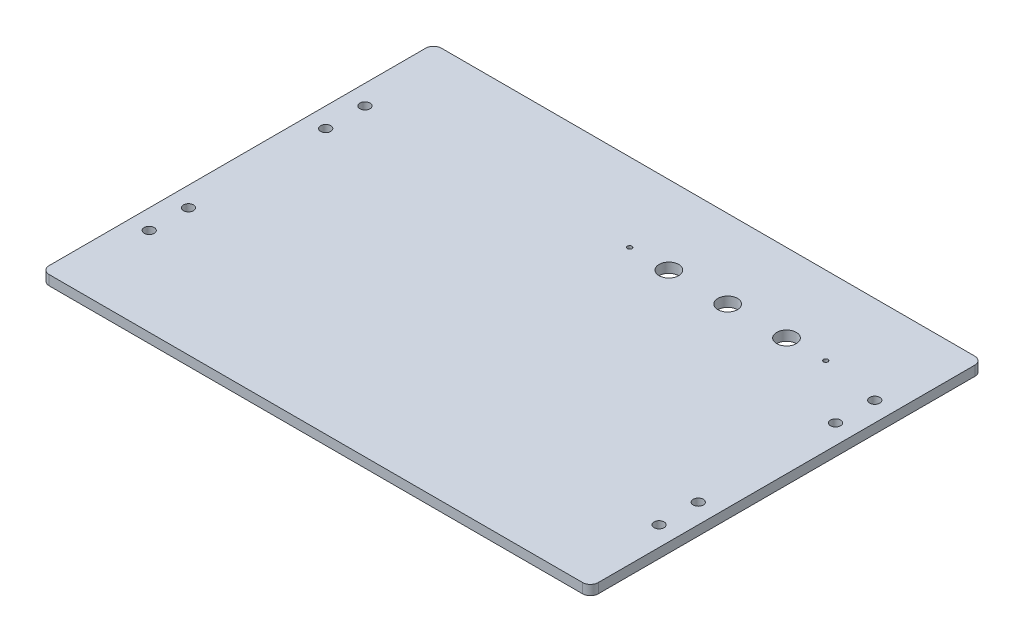
ISO-10303-21;
HEADER;
FILE_DESCRIPTION(('STEP AP214'),'2;1');
FILE_NAME('part.step','',(''),(''),'','','');
FILE_SCHEMA(('AUTOMOTIVE_DESIGN { 1 0 10303 214 1 1 1 1 }'));
ENDSEC;
DATA;
#1=APPLICATION_CONTEXT('core data for automotive mechanical design processes');
#2=APPLICATION_PROTOCOL_DEFINITION('international standard','automotive_design',2000,#1);
#3=PRODUCT_CONTEXT('',#1,'mechanical');
#4=PRODUCT('Part','Part','',(#3));
#5=PRODUCT_RELATED_PRODUCT_CATEGORY('part','',(#4));
#6=PRODUCT_DEFINITION_FORMATION('','',#4);
#7=PRODUCT_DEFINITION_CONTEXT('part definition',#1,'design');
#8=PRODUCT_DEFINITION('design','',#6,#7);
#9=PRODUCT_DEFINITION_SHAPE('','',#8);
#10=(LENGTH_UNIT() NAMED_UNIT(*) SI_UNIT(.MILLI.,.METRE.));
#11=(NAMED_UNIT(*) PLANE_ANGLE_UNIT() SI_UNIT($,.RADIAN.));
#12=(NAMED_UNIT(*) SI_UNIT($,.STERADIAN.) SOLID_ANGLE_UNIT());
#13=UNCERTAINTY_MEASURE_WITH_UNIT(LENGTH_MEASURE(1.E-05),#10,'distance_accuracy_value','');
#14=(GEOMETRIC_REPRESENTATION_CONTEXT(3) GLOBAL_UNCERTAINTY_ASSIGNED_CONTEXT((#13)) GLOBAL_UNIT_ASSIGNED_CONTEXT((#10,
#11,#12)) REPRESENTATION_CONTEXT('',''));
#15=CARTESIAN_POINT('',(0.,0.,0.));
#16=DIRECTION('',(0.,0.,1.));
#17=DIRECTION('',(1.,0.,0.));
#18=AXIS2_PLACEMENT_3D('',#15,#16,#17);
#19=CARTESIAN_POINT('',(177.8,6.35,0.));
#20=DIRECTION('',(1.,0.,0.));
#21=DIRECTION('',(0.,0.,-1.));
#22=AXIS2_PLACEMENT_3D('',#19,#20,#21);
#23=PLANE('',#22);
#24=DIRECTION('',(0.,0.,1.));
#25=VECTOR('',#24,1.);
#26=CARTESIAN_POINT('',(177.8,0.,0.));
#27=LINE('',#26,#25);
#28=CARTESIAN_POINT('',(177.8,0.,-121.92));
#29=VERTEX_POINT('',#28);
#30=CARTESIAN_POINT('',(177.8,0.,121.92));
#31=VERTEX_POINT('',#30);
#32=EDGE_CURVE('E129',#29,#31,#27,.T.);
#33=ORIENTED_EDGE('',*,*,#32,.F.);
#34=DIRECTION('',(0.,-1.,0.));
#35=VECTOR('',#34,1.);
#36=CARTESIAN_POINT('',(177.8,6.35,-121.92));
#37=LINE('',#36,#35);
#38=CARTESIAN_POINT('',(177.8,6.35,-121.92));
#39=VERTEX_POINT('',#38);
#40=EDGE_CURVE('E152',#29,#39,#37,.F.);
#41=ORIENTED_EDGE('',*,*,#40,.T.);
#42=DIRECTION('',(0.,0.,1.));
#43=VECTOR('',#42,1.);
#44=CARTESIAN_POINT('',(177.8,6.35,0.));
#45=LINE('',#44,#43);
#46=CARTESIAN_POINT('',(177.8,6.35,121.92));
#47=VERTEX_POINT('',#46);
#48=EDGE_CURVE('E127',#39,#47,#45,.T.);
#49=ORIENTED_EDGE('',*,*,#48,.T.);
#50=DIRECTION('',(0.,-1.,0.));
#51=VECTOR('',#50,1.);
#52=CARTESIAN_POINT('',(177.8,0.,121.92));
#53=LINE('',#52,#51);
#54=EDGE_CURVE('E149',#47,#31,#53,.T.);
#55=ORIENTED_EDGE('',*,*,#54,.T.);
#56=EDGE_LOOP('',(#33,#41,#49,#55));
#57=FACE_BOUND('',#56,.T.);
#58=ADVANCED_FACE('F34',(#57),#23,.T.);
#59=CARTESIAN_POINT('',(0.,6.35,-127.));
#60=DIRECTION('',(0.,0.,-1.));
#61=DIRECTION('',(-1.,0.,0.));
#62=AXIS2_PLACEMENT_3D('',#59,#60,#61);
#63=PLANE('',#62);
#64=DIRECTION('',(1.,0.,0.));
#65=VECTOR('',#64,1.);
#66=CARTESIAN_POINT('',(0.,0.,-127.));
#67=LINE('',#66,#65);
#68=CARTESIAN_POINT('',(-172.72,0.,-127.));
#69=VERTEX_POINT('',#68);
#70=CARTESIAN_POINT('',(172.72,0.,-127.));
#71=VERTEX_POINT('',#70);
#72=EDGE_CURVE('E125',#69,#71,#67,.T.);
#73=ORIENTED_EDGE('',*,*,#72,.F.);
#74=DIRECTION('',(0.,-1.,0.));
#75=VECTOR('',#74,1.);
#76=CARTESIAN_POINT('',(-172.72,6.35,-127.));
#77=LINE('',#76,#75);
#78=CARTESIAN_POINT('',(-172.72,6.35,-127.));
#79=VERTEX_POINT('',#78);
#80=EDGE_CURVE('E104',#69,#79,#77,.F.);
#81=ORIENTED_EDGE('',*,*,#80,.T.);
#82=DIRECTION('',(1.,0.,0.));
#83=VECTOR('',#82,1.);
#84=CARTESIAN_POINT('',(0.,6.35,-127.));
#85=LINE('',#84,#83);
#86=CARTESIAN_POINT('',(172.72,6.35,-127.));
#87=VERTEX_POINT('',#86);
#88=EDGE_CURVE('E168',#79,#87,#85,.T.);
#89=ORIENTED_EDGE('',*,*,#88,.T.);
#90=DIRECTION('',(0.,-1.,0.));
#91=VECTOR('',#90,1.);
#92=CARTESIAN_POINT('',(172.72,6.35,-127.));
#93=LINE('',#92,#91);
#94=EDGE_CURVE('E109',#87,#71,#93,.T.);
#95=ORIENTED_EDGE('',*,*,#94,.T.);
#96=EDGE_LOOP('',(#73,#81,#89,#95));
#97=FACE_BOUND('',#96,.T.);
#98=ADVANCED_FACE('F295',(#97),#63,.T.);
#99=CARTESIAN_POINT('',(-177.8,6.35,0.));
#100=DIRECTION('',(1.,0.,0.));
#101=DIRECTION('',(0.,0.,-1.));
#102=AXIS2_PLACEMENT_3D('',#99,#100,#101);
#103=PLANE('',#102);
#104=DIRECTION('',(0.,0.,1.));
#105=VECTOR('',#104,1.);
#106=CARTESIAN_POINT('',(-177.8,6.35,0.));
#107=LINE('',#106,#105);
#108=CARTESIAN_POINT('',(-177.8,6.35,-121.92));
#109=VERTEX_POINT('',#108);
#110=CARTESIAN_POINT('',(-177.8,6.35,121.92));
#111=VERTEX_POINT('',#110);
#112=EDGE_CURVE('E118',#109,#111,#107,.T.);
#113=ORIENTED_EDGE('',*,*,#112,.F.);
#114=DIRECTION('',(0.,-1.,0.));
#115=VECTOR('',#114,1.);
#116=CARTESIAN_POINT('',(-177.8,0.,-121.92));
#117=LINE('',#116,#115);
#118=CARTESIAN_POINT('',(-177.8,0.,-121.92));
#119=VERTEX_POINT('',#118);
#120=EDGE_CURVE('E103',#109,#119,#117,.T.);
#121=ORIENTED_EDGE('',*,*,#120,.T.);
#122=DIRECTION('',(0.,0.,1.));
#123=VECTOR('',#122,1.);
#124=CARTESIAN_POINT('',(-177.8,0.,0.));
#125=LINE('',#124,#123);
#126=CARTESIAN_POINT('',(-177.8,0.,121.92));
#127=VERTEX_POINT('',#126);
#128=EDGE_CURVE('E116',#119,#127,#125,.T.);
#129=ORIENTED_EDGE('',*,*,#128,.T.);
#130=DIRECTION('',(0.,-1.,0.));
#131=VECTOR('',#130,1.);
#132=CARTESIAN_POINT('',(-177.8,6.35,121.92));
#133=LINE('',#132,#131);
#134=EDGE_CURVE('E120',#127,#111,#133,.F.);
#135=ORIENTED_EDGE('',*,*,#134,.T.);
#136=EDGE_LOOP('',(#113,#121,#129,#135));
#137=FACE_BOUND('',#136,.T.);
#138=ADVANCED_FACE('F115',(#137),#103,.F.);
#139=CARTESIAN_POINT('',(0.,6.35,127.));
#140=DIRECTION('',(0.,0.,-1.));
#141=DIRECTION('',(-1.,0.,0.));
#142=AXIS2_PLACEMENT_3D('',#139,#140,#141);
#143=PLANE('',#142);
#144=DIRECTION('',(1.,0.,0.));
#145=VECTOR('',#144,1.);
#146=CARTESIAN_POINT('',(0.,0.,127.));
#147=LINE('',#146,#145);
#148=CARTESIAN_POINT('',(-172.72,0.,127.));
#149=VERTEX_POINT('',#148);
#150=CARTESIAN_POINT('',(172.72,0.,127.));
#151=VERTEX_POINT('',#150);
#152=EDGE_CURVE('E124',#149,#151,#147,.T.);
#153=ORIENTED_EDGE('',*,*,#152,.T.);
#154=DIRECTION('',(0.,-1.,0.));
#155=VECTOR('',#154,1.);
#156=CARTESIAN_POINT('',(172.72,6.35,127.));
#157=LINE('',#156,#155);
#158=CARTESIAN_POINT('',(172.72,6.35,127.));
#159=VERTEX_POINT('',#158);
#160=EDGE_CURVE('E11',#151,#159,#157,.F.);
#161=ORIENTED_EDGE('',*,*,#160,.T.);
#162=DIRECTION('',(1.,0.,0.));
#163=VECTOR('',#162,1.);
#164=CARTESIAN_POINT('',(0.,6.35,127.));
#165=LINE('',#164,#163);
#166=CARTESIAN_POINT('',(-172.72,6.35,127.));
#167=VERTEX_POINT('',#166);
#168=EDGE_CURVE('E133',#167,#159,#165,.T.);
#169=ORIENTED_EDGE('',*,*,#168,.F.);
#170=DIRECTION('',(0.,-1.,0.));
#171=VECTOR('',#170,1.);
#172=CARTESIAN_POINT('',(-172.72,6.35,127.));
#173=LINE('',#172,#171);
#174=EDGE_CURVE('E42',#167,#149,#173,.T.);
#175=ORIENTED_EDGE('',*,*,#174,.T.);
#176=EDGE_LOOP('',(#153,#161,#169,#175));
#177=FACE_BOUND('',#176,.T.);
#178=ADVANCED_FACE('F155',(#177),#143,.F.);
#179=CARTESIAN_POINT('',(0.,6.35,0.));
#180=DIRECTION('',(0.,1.,0.));
#181=DIRECTION('',(0.,0.,1.));
#182=AXIS2_PLACEMENT_3D('',#179,#180,#181);
#183=PLANE('',#182);
#184=CARTESIAN_POINT('',(0.,6.35,-76.2));
#185=DIRECTION('',(0.,1.,0.));
#186=DIRECTION('',(0.,0.,1.));
#187=AXIS2_PLACEMENT_3D('',#184,#185,#186);
#188=CIRCLE('',#187,1.4605);
#189=CARTESIAN_POINT('',(0.,6.35,-74.7395));
#190=VERTEX_POINT('',#189);
#191=EDGE_CURVE('E250',#190,#190,#188,.T.);
#192=ORIENTED_EDGE('',*,*,#191,.F.);
#193=EDGE_LOOP('',(#192));
#194=FACE_BOUND('',#193,.T.);
#195=CARTESIAN_POINT('',(127.,6.35,-76.2));
#196=DIRECTION('',(0.,1.,0.));
#197=DIRECTION('',(0.,0.,1.));
#198=AXIS2_PLACEMENT_3D('',#195,#196,#197);
#199=CIRCLE('',#198,1.4605);
#200=CARTESIAN_POINT('',(127.,6.35,-74.7395));
#201=VERTEX_POINT('',#200);
#202=EDGE_CURVE('E244',#201,#201,#199,.T.);
#203=ORIENTED_EDGE('',*,*,#202,.F.);
#204=EDGE_LOOP('',(#203));
#205=FACE_BOUND('',#204,.T.);
#206=CARTESIAN_POINT('',(63.5,6.35,-76.2));
#207=DIRECTION('',(0.,1.,0.));
#208=DIRECTION('',(0.,0.,1.));
#209=AXIS2_PLACEMENT_3D('',#206,#207,#208);
#210=CIRCLE('',#209,6.35000000000001);
#211=CARTESIAN_POINT('',(63.5,6.35,-69.85));
#212=VERTEX_POINT('',#211);
#213=EDGE_CURVE('E239',#212,#212,#210,.T.);
#214=ORIENTED_EDGE('',*,*,#213,.F.);
#215=EDGE_LOOP('',(#214));
#216=FACE_BOUND('',#215,.T.);
#217=CARTESIAN_POINT('',(101.6,6.35,-76.2));
#218=DIRECTION('',(0.,1.,0.));
#219=DIRECTION('',(0.,0.,1.));
#220=AXIS2_PLACEMENT_3D('',#217,#218,#219);
#221=CIRCLE('',#220,6.34999999999999);
#222=CARTESIAN_POINT('',(101.6,6.35,-69.85));
#223=VERTEX_POINT('',#222);
#224=EDGE_CURVE('E232',#223,#223,#221,.T.);
#225=ORIENTED_EDGE('',*,*,#224,.F.);
#226=EDGE_LOOP('',(#225));
#227=FACE_BOUND('',#226,.T.);
#228=CARTESIAN_POINT('',(25.4,6.35,-76.2));
#229=DIRECTION('',(0.,1.,0.));
#230=DIRECTION('',(0.,0.,1.));
#231=AXIS2_PLACEMENT_3D('',#228,#229,#230);
#232=CIRCLE('',#231,6.35);
#233=CARTESIAN_POINT('',(25.4,6.35,-69.85));
#234=VERTEX_POINT('',#233);
#235=EDGE_CURVE('E226',#234,#234,#232,.T.);
#236=ORIENTED_EDGE('',*,*,#235,.F.);
#237=EDGE_LOOP('',(#236));
#238=FACE_BOUND('',#237,.T.);
#239=CARTESIAN_POINT('',(-165.1,6.35,-44.45));
#240=DIRECTION('',(0.,1.,0.));
#241=DIRECTION('',(0.,0.,1.));
#242=AXIS2_PLACEMENT_3D('',#239,#240,#241);
#243=CIRCLE('',#242,3.26389999999998);
#244=CARTESIAN_POINT('',(-165.1,6.35,-41.1861));
#245=VERTEX_POINT('',#244);
#246=EDGE_CURVE('E221',#245,#245,#243,.T.);
#247=ORIENTED_EDGE('',*,*,#246,.F.);
#248=EDGE_LOOP('',(#247));
#249=FACE_BOUND('',#248,.T.);
#250=CARTESIAN_POINT('',(-165.1,6.35,44.45));
#251=DIRECTION('',(0.,1.,0.));
#252=DIRECTION('',(0.,0.,1.));
#253=AXIS2_PLACEMENT_3D('',#250,#251,#252);
#254=CIRCLE('',#253,3.26389999999998);
#255=CARTESIAN_POINT('',(-165.1,6.35,47.7139));
#256=VERTEX_POINT('',#255);
#257=EDGE_CURVE('E215',#256,#256,#254,.T.);
#258=ORIENTED_EDGE('',*,*,#257,.F.);
#259=EDGE_LOOP('',(#258));
#260=FACE_BOUND('',#259,.T.);
#261=CARTESIAN_POINT('',(-165.1,6.35,69.85));
#262=DIRECTION('',(0.,1.,0.));
#263=DIRECTION('',(0.,0.,1.));
#264=AXIS2_PLACEMENT_3D('',#261,#262,#263);
#265=CIRCLE('',#264,3.26390000000001);
#266=CARTESIAN_POINT('',(-165.1,6.35,73.1139));
#267=VERTEX_POINT('',#266);
#268=EDGE_CURVE('E209',#267,#267,#265,.T.);
#269=ORIENTED_EDGE('',*,*,#268,.F.);
#270=EDGE_LOOP('',(#269));
#271=FACE_BOUND('',#270,.T.);
#272=CARTESIAN_POINT('',(165.1,6.35,69.85));
#273=DIRECTION('',(0.,1.,0.));
#274=DIRECTION('',(0.,0.,-1.));
#275=AXIS2_PLACEMENT_3D('',#272,#273,#274);
#276=CIRCLE('',#275,3.26390000000001);
#277=CARTESIAN_POINT('',(165.1,6.35,66.5861));
#278=VERTEX_POINT('',#277);
#279=EDGE_CURVE('E203',#278,#278,#276,.T.);
#280=ORIENTED_EDGE('',*,*,#279,.F.);
#281=EDGE_LOOP('',(#280));
#282=FACE_BOUND('',#281,.T.);
#283=CARTESIAN_POINT('',(165.1,6.35,44.45));
#284=DIRECTION('',(0.,1.,0.));
#285=DIRECTION('',(0.,0.,-1.));
#286=AXIS2_PLACEMENT_3D('',#283,#284,#285);
#287=CIRCLE('',#286,3.26389999999998);
#288=CARTESIAN_POINT('',(165.1,6.35,41.1861));
#289=VERTEX_POINT('',#288);
#290=EDGE_CURVE('E197',#289,#289,#287,.T.);
#291=ORIENTED_EDGE('',*,*,#290,.F.);
#292=EDGE_LOOP('',(#291));
#293=FACE_BOUND('',#292,.T.);
#294=CARTESIAN_POINT('',(165.1,6.35,-44.45));
#295=DIRECTION('',(0.,1.,0.));
#296=DIRECTION('',(0.,0.,-1.));
#297=AXIS2_PLACEMENT_3D('',#294,#295,#296);
#298=CIRCLE('',#297,3.26389999999998);
#299=CARTESIAN_POINT('',(165.1,6.35,-47.7139));
#300=VERTEX_POINT('',#299);
#301=EDGE_CURVE('E191',#300,#300,#298,.T.);
#302=ORIENTED_EDGE('',*,*,#301,.F.);
#303=EDGE_LOOP('',(#302));
#304=FACE_BOUND('',#303,.T.);
#305=CARTESIAN_POINT('',(165.1,6.35,-69.85));
#306=DIRECTION('',(0.,1.,0.));
#307=DIRECTION('',(0.,0.,-1.));
#308=AXIS2_PLACEMENT_3D('',#305,#306,#307);
#309=CIRCLE('',#308,3.26389999999998);
#310=CARTESIAN_POINT('',(165.1,6.35,-73.1139));
#311=VERTEX_POINT('',#310);
#312=EDGE_CURVE('E184',#311,#311,#309,.T.);
#313=ORIENTED_EDGE('',*,*,#312,.F.);
#314=EDGE_LOOP('',(#313));
#315=FACE_BOUND('',#314,.T.);
#316=CARTESIAN_POINT('',(-165.1,6.35,-69.85));
#317=DIRECTION('',(0.,1.,0.));
#318=DIRECTION('',(0.,0.,1.));
#319=AXIS2_PLACEMENT_3D('',#316,#317,#318);
#320=CIRCLE('',#319,3.26389999999998);
#321=CARTESIAN_POINT('',(-165.1,6.35,-66.5861));
#322=VERTEX_POINT('',#321);
#323=EDGE_CURVE('E173',#322,#322,#320,.T.);
#324=ORIENTED_EDGE('',*,*,#323,.F.);
#325=EDGE_LOOP('',(#324));
#326=FACE_BOUND('',#325,.T.);
#327=ORIENTED_EDGE('',*,*,#88,.F.);
#328=CARTESIAN_POINT('',(-172.72,6.35,-121.92));
#329=DIRECTION('',(0.,1.,0.));
#330=DIRECTION('',(0.,0.,1.));
#331=AXIS2_PLACEMENT_3D('',#328,#329,#330);
#332=CIRCLE('',#331,5.08);
#333=EDGE_CURVE('E147',#79,#109,#332,.T.);
#334=ORIENTED_EDGE('',*,*,#333,.T.);
#335=ORIENTED_EDGE('',*,*,#112,.T.);
#336=CARTESIAN_POINT('',(-172.72,6.35,121.92));
#337=DIRECTION('',(0.,1.,0.));
#338=DIRECTION('',(0.,0.,1.));
#339=AXIS2_PLACEMENT_3D('',#336,#337,#338);
#340=CIRCLE('',#339,5.08);
#341=EDGE_CURVE('E54',#111,#167,#340,.T.);
#342=ORIENTED_EDGE('',*,*,#341,.T.);
#343=ORIENTED_EDGE('',*,*,#168,.T.);
#344=CARTESIAN_POINT('',(172.72,6.35,121.92));
#345=DIRECTION('',(0.,1.,0.));
#346=DIRECTION('',(0.,0.,1.));
#347=AXIS2_PLACEMENT_3D('',#344,#345,#346);
#348=CIRCLE('',#347,5.08);
#349=EDGE_CURVE('E143',#159,#47,#348,.T.);
#350=ORIENTED_EDGE('',*,*,#349,.T.);
#351=ORIENTED_EDGE('',*,*,#48,.F.);
#352=CARTESIAN_POINT('',(172.72,6.35,-121.92));
#353=DIRECTION('',(0.,1.,0.));
#354=DIRECTION('',(0.,0.,1.));
#355=AXIS2_PLACEMENT_3D('',#352,#353,#354);
#356=CIRCLE('',#355,5.08);
#357=EDGE_CURVE('E145',#39,#87,#356,.T.);
#358=ORIENTED_EDGE('',*,*,#357,.T.);
#359=EDGE_LOOP('',(#327,#334,#335,#342,#343,#350,#351,#358));
#360=FACE_BOUND('',#359,.T.);
#361=ADVANCED_FACE('F265',(#194,#205,#216,#227,#238,#249,#260,#271,#282,#293,#304,#315,#326,
#360),#183,.T.);
#362=CARTESIAN_POINT('',(0.,0.,0.));
#363=DIRECTION('',(0.,1.,0.));
#364=DIRECTION('',(0.,0.,1.));
#365=AXIS2_PLACEMENT_3D('',#362,#363,#364);
#366=PLANE('',#365);
#367=CARTESIAN_POINT('',(0.,0.,-76.2));
#368=DIRECTION('',(0.,1.,0.));
#369=DIRECTION('',(0.,0.,1.));
#370=AXIS2_PLACEMENT_3D('',#367,#368,#369);
#371=CIRCLE('',#370,1.4605);
#372=CARTESIAN_POINT('',(0.,0.,-74.7395));
#373=VERTEX_POINT('',#372);
#374=EDGE_CURVE('E247',#373,#373,#371,.T.);
#375=ORIENTED_EDGE('',*,*,#374,.T.);
#376=EDGE_LOOP('',(#375));
#377=FACE_BOUND('',#376,.T.);
#378=CARTESIAN_POINT('',(127.,0.,-76.2));
#379=DIRECTION('',(0.,1.,0.));
#380=DIRECTION('',(0.,0.,1.));
#381=AXIS2_PLACEMENT_3D('',#378,#379,#380);
#382=CIRCLE('',#381,1.4605);
#383=CARTESIAN_POINT('',(127.,0.,-74.7395));
#384=VERTEX_POINT('',#383);
#385=EDGE_CURVE('E236',#384,#384,#382,.T.);
#386=ORIENTED_EDGE('',*,*,#385,.T.);
#387=EDGE_LOOP('',(#386));
#388=FACE_BOUND('',#387,.T.);
#389=CARTESIAN_POINT('',(63.5,0.,-76.2));
#390=DIRECTION('',(0.,1.,0.));
#391=DIRECTION('',(0.,0.,1.));
#392=AXIS2_PLACEMENT_3D('',#389,#390,#391);
#393=CIRCLE('',#392,6.35000000000001);
#394=CARTESIAN_POINT('',(63.5,0.,-69.85));
#395=VERTEX_POINT('',#394);
#396=EDGE_CURVE('E229',#395,#395,#393,.T.);
#397=ORIENTED_EDGE('',*,*,#396,.T.);
#398=EDGE_LOOP('',(#397));
#399=FACE_BOUND('',#398,.T.);
#400=CARTESIAN_POINT('',(101.6,0.,-76.2));
#401=DIRECTION('',(0.,1.,0.));
#402=DIRECTION('',(0.,0.,1.));
#403=AXIS2_PLACEMENT_3D('',#400,#401,#402);
#404=CIRCLE('',#403,6.34999999999999);
#405=CARTESIAN_POINT('',(101.6,0.,-69.85));
#406=VERTEX_POINT('',#405);
#407=EDGE_CURVE('E235',#406,#406,#404,.T.);
#408=ORIENTED_EDGE('',*,*,#407,.T.);
#409=EDGE_LOOP('',(#408));
#410=FACE_BOUND('',#409,.T.);
#411=CARTESIAN_POINT('',(25.4,0.,-76.2));
#412=DIRECTION('',(0.,1.,0.));
#413=DIRECTION('',(0.,0.,1.));
#414=AXIS2_PLACEMENT_3D('',#411,#412,#413);
#415=CIRCLE('',#414,6.35);
#416=CARTESIAN_POINT('',(25.4,0.,-69.85));
#417=VERTEX_POINT('',#416);
#418=EDGE_CURVE('E188',#417,#417,#415,.T.);
#419=ORIENTED_EDGE('',*,*,#418,.T.);
#420=EDGE_LOOP('',(#419));
#421=FACE_BOUND('',#420,.T.);
#422=CARTESIAN_POINT('',(-165.1,0.,-44.45));
#423=DIRECTION('',(0.,1.,0.));
#424=DIRECTION('',(0.,0.,1.));
#425=AXIS2_PLACEMENT_3D('',#422,#423,#424);
#426=CIRCLE('',#425,3.26389999999998);
#427=CARTESIAN_POINT('',(-165.1,0.,-41.1861));
#428=VERTEX_POINT('',#427);
#429=EDGE_CURVE('E182',#428,#428,#426,.T.);
#430=ORIENTED_EDGE('',*,*,#429,.T.);
#431=EDGE_LOOP('',(#430));
#432=FACE_BOUND('',#431,.T.);
#433=CARTESIAN_POINT('',(-165.1,0.,44.45));
#434=DIRECTION('',(0.,1.,0.));
#435=DIRECTION('',(0.,0.,1.));
#436=AXIS2_PLACEMENT_3D('',#433,#434,#435);
#437=CIRCLE('',#436,3.26389999999998);
#438=CARTESIAN_POINT('',(-165.1,0.,47.7139));
#439=VERTEX_POINT('',#438);
#440=EDGE_CURVE('E218',#439,#439,#437,.T.);
#441=ORIENTED_EDGE('',*,*,#440,.T.);
#442=EDGE_LOOP('',(#441));
#443=FACE_BOUND('',#442,.T.);
#444=CARTESIAN_POINT('',(-165.1,0.,69.85));
#445=DIRECTION('',(0.,1.,0.));
#446=DIRECTION('',(0.,0.,1.));
#447=AXIS2_PLACEMENT_3D('',#444,#445,#446);
#448=CIRCLE('',#447,3.26390000000001);
#449=CARTESIAN_POINT('',(-165.1,0.,73.1139));
#450=VERTEX_POINT('',#449);
#451=EDGE_CURVE('E212',#450,#450,#448,.T.);
#452=ORIENTED_EDGE('',*,*,#451,.T.);
#453=EDGE_LOOP('',(#452));
#454=FACE_BOUND('',#453,.T.);
#455=CARTESIAN_POINT('',(165.1,0.,69.85));
#456=DIRECTION('',(0.,1.,0.));
#457=DIRECTION('',(0.,0.,-1.));
#458=AXIS2_PLACEMENT_3D('',#455,#456,#457);
#459=CIRCLE('',#458,3.26390000000001);
#460=CARTESIAN_POINT('',(165.1,0.,66.5861));
#461=VERTEX_POINT('',#460);
#462=EDGE_CURVE('E206',#461,#461,#459,.T.);
#463=ORIENTED_EDGE('',*,*,#462,.T.);
#464=EDGE_LOOP('',(#463));
#465=FACE_BOUND('',#464,.T.);
#466=CARTESIAN_POINT('',(165.1,0.,44.45));
#467=DIRECTION('',(0.,1.,0.));
#468=DIRECTION('',(0.,0.,-1.));
#469=AXIS2_PLACEMENT_3D('',#466,#467,#468);
#470=CIRCLE('',#469,3.26389999999998);
#471=CARTESIAN_POINT('',(165.1,0.,41.1861));
#472=VERTEX_POINT('',#471);
#473=EDGE_CURVE('E200',#472,#472,#470,.T.);
#474=ORIENTED_EDGE('',*,*,#473,.T.);
#475=EDGE_LOOP('',(#474));
#476=FACE_BOUND('',#475,.T.);
#477=CARTESIAN_POINT('',(165.1,0.,-44.45));
#478=DIRECTION('',(0.,1.,0.));
#479=DIRECTION('',(0.,0.,-1.));
#480=AXIS2_PLACEMENT_3D('',#477,#478,#479);
#481=CIRCLE('',#480,3.26389999999998);
#482=CARTESIAN_POINT('',(165.1,0.,-47.7139));
#483=VERTEX_POINT('',#482);
#484=EDGE_CURVE('E194',#483,#483,#481,.T.);
#485=ORIENTED_EDGE('',*,*,#484,.T.);
#486=EDGE_LOOP('',(#485));
#487=FACE_BOUND('',#486,.T.);
#488=CARTESIAN_POINT('',(165.1,0.,-69.85));
#489=DIRECTION('',(0.,1.,0.));
#490=DIRECTION('',(0.,0.,-1.));
#491=AXIS2_PLACEMENT_3D('',#488,#489,#490);
#492=CIRCLE('',#491,3.26389999999998);
#493=CARTESIAN_POINT('',(165.1,0.,-73.1139));
#494=VERTEX_POINT('',#493);
#495=EDGE_CURVE('E187',#494,#494,#492,.T.);
#496=ORIENTED_EDGE('',*,*,#495,.T.);
#497=EDGE_LOOP('',(#496));
#498=FACE_BOUND('',#497,.T.);
#499=CARTESIAN_POINT('',(-165.1,0.,-69.85));
#500=DIRECTION('',(0.,1.,0.));
#501=DIRECTION('',(0.,0.,1.));
#502=AXIS2_PLACEMENT_3D('',#499,#500,#501);
#503=CIRCLE('',#502,3.26389999999998);
#504=CARTESIAN_POINT('',(-165.1,0.,-66.5861));
#505=VERTEX_POINT('',#504);
#506=EDGE_CURVE('E177',#505,#505,#503,.T.);
#507=ORIENTED_EDGE('',*,*,#506,.T.);
#508=EDGE_LOOP('',(#507));
#509=FACE_BOUND('',#508,.T.);
#510=ORIENTED_EDGE('',*,*,#128,.F.);
#511=CARTESIAN_POINT('',(-172.72,0.,-121.92));
#512=DIRECTION('',(0.,1.,0.));
#513=DIRECTION('',(0.,0.,1.));
#514=AXIS2_PLACEMENT_3D('',#511,#512,#513);
#515=CIRCLE('',#514,5.08);
#516=EDGE_CURVE('E99',#119,#69,#515,.F.);
#517=ORIENTED_EDGE('',*,*,#516,.T.);
#518=ORIENTED_EDGE('',*,*,#72,.T.);
#519=CARTESIAN_POINT('',(172.72,0.,-121.92));
#520=DIRECTION('',(0.,1.,0.));
#521=DIRECTION('',(0.,0.,1.));
#522=AXIS2_PLACEMENT_3D('',#519,#520,#521);
#523=CIRCLE('',#522,5.08);
#524=EDGE_CURVE('E110',#71,#29,#523,.F.);
#525=ORIENTED_EDGE('',*,*,#524,.T.);
#526=ORIENTED_EDGE('',*,*,#32,.T.);
#527=CARTESIAN_POINT('',(172.72,0.,121.92));
#528=DIRECTION('',(0.,1.,0.));
#529=DIRECTION('',(0.,0.,1.));
#530=AXIS2_PLACEMENT_3D('',#527,#528,#529);
#531=CIRCLE('',#530,5.08);
#532=EDGE_CURVE('E136',#31,#151,#531,.F.);
#533=ORIENTED_EDGE('',*,*,#532,.T.);
#534=ORIENTED_EDGE('',*,*,#152,.F.);
#535=CARTESIAN_POINT('',(-172.72,0.,121.92));
#536=DIRECTION('',(0.,1.,0.));
#537=DIRECTION('',(0.,0.,1.));
#538=AXIS2_PLACEMENT_3D('',#535,#536,#537);
#539=CIRCLE('',#538,5.08);
#540=EDGE_CURVE('E119',#149,#127,#539,.F.);
#541=ORIENTED_EDGE('',*,*,#540,.T.);
#542=EDGE_LOOP('',(#510,#517,#518,#525,#526,#533,#534,#541));
#543=FACE_BOUND('',#542,.T.);
#544=ADVANCED_FACE('F122',(#377,#388,#399,#410,#421,#432,#443,#454,#465,#476,#487,#498,#509,
#543),#366,.F.);
#545=CARTESIAN_POINT('',(-165.1,0.,-69.85));
#546=DIRECTION('',(0.,1.,0.));
#547=DIRECTION('',(0.,0.,1.));
#548=AXIS2_PLACEMENT_3D('',#545,#546,#547);
#549=CYLINDRICAL_SURFACE('',#548,3.26389999999998);
#550=ORIENTED_EDGE('',*,*,#506,.F.);
#551=EDGE_LOOP('',(#550));
#552=FACE_BOUND('',#551,.T.);
#553=ORIENTED_EDGE('',*,*,#323,.T.);
#554=EDGE_LOOP('',(#553));
#555=FACE_BOUND('',#554,.T.);
#556=ADVANCED_FACE('F317',(#552,#555),#549,.F.);
#557=CARTESIAN_POINT('',(165.1,0.,-69.85));
#558=DIRECTION('',(0.,1.,0.));
#559=DIRECTION('',(0.,0.,1.));
#560=AXIS2_PLACEMENT_3D('',#557,#558,#559);
#561=CYLINDRICAL_SURFACE('',#560,3.26389999999998);
#562=ORIENTED_EDGE('',*,*,#495,.F.);
#563=EDGE_LOOP('',(#562));
#564=FACE_BOUND('',#563,.T.);
#565=ORIENTED_EDGE('',*,*,#312,.T.);
#566=EDGE_LOOP('',(#565));
#567=FACE_BOUND('',#566,.T.);
#568=ADVANCED_FACE('F321',(#564,#567),#561,.F.);
#569=CARTESIAN_POINT('',(165.1,0.,-44.45));
#570=DIRECTION('',(0.,1.,0.));
#571=DIRECTION('',(0.,0.,1.));
#572=AXIS2_PLACEMENT_3D('',#569,#570,#571);
#573=CYLINDRICAL_SURFACE('',#572,3.26389999999998);
#574=ORIENTED_EDGE('',*,*,#484,.F.);
#575=EDGE_LOOP('',(#574));
#576=FACE_BOUND('',#575,.T.);
#577=ORIENTED_EDGE('',*,*,#301,.T.);
#578=EDGE_LOOP('',(#577));
#579=FACE_BOUND('',#578,.T.);
#580=ADVANCED_FACE('F325',(#576,#579),#573,.F.);
#581=CARTESIAN_POINT('',(165.1,0.,44.45));
#582=DIRECTION('',(0.,1.,0.));
#583=DIRECTION('',(0.,0.,1.));
#584=AXIS2_PLACEMENT_3D('',#581,#582,#583);
#585=CYLINDRICAL_SURFACE('',#584,3.26389999999998);
#586=ORIENTED_EDGE('',*,*,#473,.F.);
#587=EDGE_LOOP('',(#586));
#588=FACE_BOUND('',#587,.T.);
#589=ORIENTED_EDGE('',*,*,#290,.T.);
#590=EDGE_LOOP('',(#589));
#591=FACE_BOUND('',#590,.T.);
#592=ADVANCED_FACE('F329',(#588,#591),#585,.F.);
#593=CARTESIAN_POINT('',(165.1,0.,69.85));
#594=DIRECTION('',(0.,1.,0.));
#595=DIRECTION('',(0.,0.,1.));
#596=AXIS2_PLACEMENT_3D('',#593,#594,#595);
#597=CYLINDRICAL_SURFACE('',#596,3.26390000000001);
#598=ORIENTED_EDGE('',*,*,#462,.F.);
#599=EDGE_LOOP('',(#598));
#600=FACE_BOUND('',#599,.T.);
#601=ORIENTED_EDGE('',*,*,#279,.T.);
#602=EDGE_LOOP('',(#601));
#603=FACE_BOUND('',#602,.T.);
#604=ADVANCED_FACE('F333',(#600,#603),#597,.F.);
#605=CARTESIAN_POINT('',(-165.1,0.,69.85));
#606=DIRECTION('',(0.,1.,0.));
#607=DIRECTION('',(0.,0.,1.));
#608=AXIS2_PLACEMENT_3D('',#605,#606,#607);
#609=CYLINDRICAL_SURFACE('',#608,3.26390000000001);
#610=ORIENTED_EDGE('',*,*,#451,.F.);
#611=EDGE_LOOP('',(#610));
#612=FACE_BOUND('',#611,.T.);
#613=ORIENTED_EDGE('',*,*,#268,.T.);
#614=EDGE_LOOP('',(#613));
#615=FACE_BOUND('',#614,.T.);
#616=ADVANCED_FACE('F337',(#612,#615),#609,.F.);
#617=CARTESIAN_POINT('',(-165.1,0.,44.45));
#618=DIRECTION('',(0.,1.,0.));
#619=DIRECTION('',(0.,0.,1.));
#620=AXIS2_PLACEMENT_3D('',#617,#618,#619);
#621=CYLINDRICAL_SURFACE('',#620,3.26389999999998);
#622=ORIENTED_EDGE('',*,*,#440,.F.);
#623=EDGE_LOOP('',(#622));
#624=FACE_BOUND('',#623,.T.);
#625=ORIENTED_EDGE('',*,*,#257,.T.);
#626=EDGE_LOOP('',(#625));
#627=FACE_BOUND('',#626,.T.);
#628=ADVANCED_FACE('F341',(#624,#627),#621,.F.);
#629=CARTESIAN_POINT('',(-165.1,0.,-44.45));
#630=DIRECTION('',(0.,1.,0.));
#631=DIRECTION('',(0.,0.,1.));
#632=AXIS2_PLACEMENT_3D('',#629,#630,#631);
#633=CYLINDRICAL_SURFACE('',#632,3.26389999999998);
#634=ORIENTED_EDGE('',*,*,#429,.F.);
#635=EDGE_LOOP('',(#634));
#636=FACE_BOUND('',#635,.T.);
#637=ORIENTED_EDGE('',*,*,#246,.T.);
#638=EDGE_LOOP('',(#637));
#639=FACE_BOUND('',#638,.T.);
#640=ADVANCED_FACE('F345',(#636,#639),#633,.F.);
#641=CARTESIAN_POINT('',(25.4,0.,-76.2));
#642=DIRECTION('',(0.,1.,0.));
#643=DIRECTION('',(0.,0.,1.));
#644=AXIS2_PLACEMENT_3D('',#641,#642,#643);
#645=CYLINDRICAL_SURFACE('',#644,6.35);
#646=ORIENTED_EDGE('',*,*,#418,.F.);
#647=EDGE_LOOP('',(#646));
#648=FACE_BOUND('',#647,.T.);
#649=ORIENTED_EDGE('',*,*,#235,.T.);
#650=EDGE_LOOP('',(#649));
#651=FACE_BOUND('',#650,.T.);
#652=ADVANCED_FACE('F349',(#648,#651),#645,.F.);
#653=CARTESIAN_POINT('',(101.6,0.,-76.2));
#654=DIRECTION('',(0.,1.,0.));
#655=DIRECTION('',(0.,0.,1.));
#656=AXIS2_PLACEMENT_3D('',#653,#654,#655);
#657=CYLINDRICAL_SURFACE('',#656,6.34999999999999);
#658=ORIENTED_EDGE('',*,*,#407,.F.);
#659=EDGE_LOOP('',(#658));
#660=FACE_BOUND('',#659,.T.);
#661=ORIENTED_EDGE('',*,*,#224,.T.);
#662=EDGE_LOOP('',(#661));
#663=FACE_BOUND('',#662,.T.);
#664=ADVANCED_FACE('F353',(#660,#663),#657,.F.);
#665=CARTESIAN_POINT('',(63.5,0.,-76.2));
#666=DIRECTION('',(0.,1.,0.));
#667=DIRECTION('',(0.,0.,1.));
#668=AXIS2_PLACEMENT_3D('',#665,#666,#667);
#669=CYLINDRICAL_SURFACE('',#668,6.35000000000001);
#670=ORIENTED_EDGE('',*,*,#396,.F.);
#671=EDGE_LOOP('',(#670));
#672=FACE_BOUND('',#671,.T.);
#673=ORIENTED_EDGE('',*,*,#213,.T.);
#674=EDGE_LOOP('',(#673));
#675=FACE_BOUND('',#674,.T.);
#676=ADVANCED_FACE('F357',(#672,#675),#669,.F.);
#677=CARTESIAN_POINT('',(127.,0.,-76.2));
#678=DIRECTION('',(0.,1.,0.));
#679=DIRECTION('',(0.,0.,1.));
#680=AXIS2_PLACEMENT_3D('',#677,#678,#679);
#681=CYLINDRICAL_SURFACE('',#680,1.4605);
#682=ORIENTED_EDGE('',*,*,#385,.F.);
#683=EDGE_LOOP('',(#682));
#684=FACE_BOUND('',#683,.T.);
#685=ORIENTED_EDGE('',*,*,#202,.T.);
#686=EDGE_LOOP('',(#685));
#687=FACE_BOUND('',#686,.T.);
#688=ADVANCED_FACE('F261',(#684,#687),#681,.F.);
#689=CARTESIAN_POINT('',(0.,0.,-76.2));
#690=DIRECTION('',(0.,1.,0.));
#691=DIRECTION('',(0.,0.,1.));
#692=AXIS2_PLACEMENT_3D('',#689,#690,#691);
#693=CYLINDRICAL_SURFACE('',#692,1.4605);
#694=ORIENTED_EDGE('',*,*,#374,.F.);
#695=EDGE_LOOP('',(#694));
#696=FACE_BOUND('',#695,.T.);
#697=ORIENTED_EDGE('',*,*,#191,.T.);
#698=EDGE_LOOP('',(#697));
#699=FACE_BOUND('',#698,.T.);
#700=ADVANCED_FACE('F258',(#696,#699),#693,.F.);
#701=CARTESIAN_POINT('',(-172.72,6.35,-121.92));
#702=DIRECTION('',(0.,1.,0.));
#703=DIRECTION('',(0.,0.,1.));
#704=AXIS2_PLACEMENT_3D('',#701,#702,#703);
#705=CYLINDRICAL_SURFACE('',#704,5.08);
#706=ORIENTED_EDGE('',*,*,#333,.F.);
#707=ORIENTED_EDGE('',*,*,#80,.F.);
#708=ORIENTED_EDGE('',*,*,#516,.F.);
#709=ORIENTED_EDGE('',*,*,#120,.F.);
#710=EDGE_LOOP('',(#706,#707,#708,#709));
#711=FACE_BOUND('',#710,.T.);
#712=ADVANCED_FACE('F102',(#711),#705,.T.);
#713=CARTESIAN_POINT('',(172.72,6.35,-121.92));
#714=DIRECTION('',(0.,-1.,0.));
#715=DIRECTION('',(0.,0.,-1.));
#716=AXIS2_PLACEMENT_3D('',#713,#714,#715);
#717=CYLINDRICAL_SURFACE('',#716,5.08);
#718=ORIENTED_EDGE('',*,*,#357,.F.);
#719=ORIENTED_EDGE('',*,*,#40,.F.);
#720=ORIENTED_EDGE('',*,*,#524,.F.);
#721=ORIENTED_EDGE('',*,*,#94,.F.);
#722=EDGE_LOOP('',(#718,#719,#720,#721));
#723=FACE_BOUND('',#722,.T.);
#724=ADVANCED_FACE('F297',(#723),#717,.T.);
#725=CARTESIAN_POINT('',(172.72,6.35,121.92));
#726=DIRECTION('',(0.,1.,0.));
#727=DIRECTION('',(0.,0.,1.));
#728=AXIS2_PLACEMENT_3D('',#725,#726,#727);
#729=CYLINDRICAL_SURFACE('',#728,5.08);
#730=ORIENTED_EDGE('',*,*,#349,.F.);
#731=ORIENTED_EDGE('',*,*,#160,.F.);
#732=ORIENTED_EDGE('',*,*,#532,.F.);
#733=ORIENTED_EDGE('',*,*,#54,.F.);
#734=EDGE_LOOP('',(#730,#731,#732,#733));
#735=FACE_BOUND('',#734,.T.);
#736=ADVANCED_FACE('F162',(#735),#729,.T.);
#737=CARTESIAN_POINT('',(-172.72,6.35,121.92));
#738=DIRECTION('',(0.,-1.,0.));
#739=DIRECTION('',(0.,0.,-1.));
#740=AXIS2_PLACEMENT_3D('',#737,#738,#739);
#741=CYLINDRICAL_SURFACE('',#740,5.08);
#742=ORIENTED_EDGE('',*,*,#341,.F.);
#743=ORIENTED_EDGE('',*,*,#134,.F.);
#744=ORIENTED_EDGE('',*,*,#540,.F.);
#745=ORIENTED_EDGE('',*,*,#174,.F.);
#746=EDGE_LOOP('',(#742,#743,#744,#745));
#747=FACE_BOUND('',#746,.T.);
#748=ADVANCED_FACE('F36',(#747),#741,.T.);
#749=CLOSED_SHELL('',(#58,#98,#138,#178,#361,#544,#556,#568,#580,#592,#604,#616,#628,#640,#652,
#664,#676,#688,#700,#712,#724,#736,#748));
#750=MANIFOLD_SOLID_BREP('B2',#749);
#751=ADVANCED_BREP_SHAPE_REPRESENTATION('',(#18,#750),#14);
#752=SHAPE_DEFINITION_REPRESENTATION(#9,#751);
ENDSEC;
END-ISO-10303-21;
